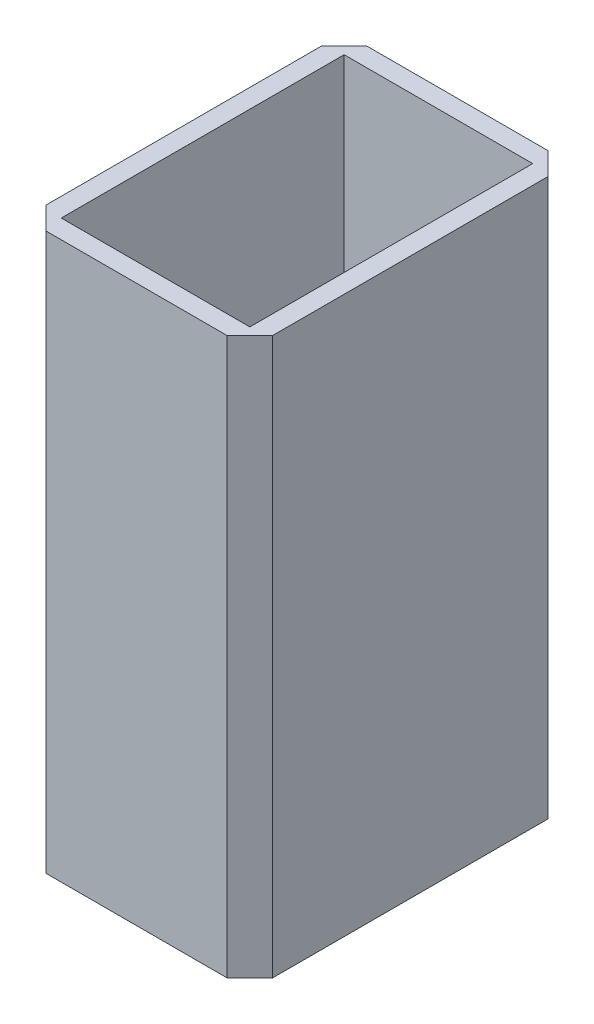
ISO-10303-21;
HEADER;
FILE_DESCRIPTION(('STEP AP214'),'2;1');
FILE_NAME('part.step','',(''),(''),'','','');
FILE_SCHEMA(('AUTOMOTIVE_DESIGN { 1 0 10303 214 1 1 1 1 }'));
ENDSEC;
DATA;
#1=APPLICATION_CONTEXT('core data for automotive mechanical design processes');
#2=APPLICATION_PROTOCOL_DEFINITION('international standard','automotive_design',2000,#1);
#3=PRODUCT_CONTEXT('',#1,'mechanical');
#4=PRODUCT('Part','Part','',(#3));
#5=PRODUCT_RELATED_PRODUCT_CATEGORY('part','',(#4));
#6=PRODUCT_DEFINITION_FORMATION('','',#4);
#7=PRODUCT_DEFINITION_CONTEXT('part definition',#1,'design');
#8=PRODUCT_DEFINITION('design','',#6,#7);
#9=PRODUCT_DEFINITION_SHAPE('','',#8);
#10=(LENGTH_UNIT() NAMED_UNIT(*) SI_UNIT(.MILLI.,.METRE.));
#11=(NAMED_UNIT(*) PLANE_ANGLE_UNIT() SI_UNIT($,.RADIAN.));
#12=(NAMED_UNIT(*) SI_UNIT($,.STERADIAN.) SOLID_ANGLE_UNIT());
#13=UNCERTAINTY_MEASURE_WITH_UNIT(LENGTH_MEASURE(1.E-05),#10,'distance_accuracy_value','');
#14=(GEOMETRIC_REPRESENTATION_CONTEXT(3) GLOBAL_UNCERTAINTY_ASSIGNED_CONTEXT((#13)) GLOBAL_UNIT_ASSIGNED_CONTEXT((#10,
#11,#12)) REPRESENTATION_CONTEXT('',''));
#15=CARTESIAN_POINT('',(0.,0.,0.));
#16=DIRECTION('',(0.,0.,1.));
#17=DIRECTION('',(1.,0.,0.));
#18=AXIS2_PLACEMENT_3D('',#15,#16,#17);
#19=CARTESIAN_POINT('',(-52.5950076131494,3.175,10.6202395854022));
#20=DIRECTION('',(1.,0.,0.));
#21=DIRECTION('',(0.,0.,-1.));
#22=AXIS2_PLACEMENT_3D('',#19,#20,#21);
#23=PLANE('',#22);
#24=DIRECTION('',(0.,0.,1.));
#25=VECTOR('',#24,1.);
#26=CARTESIAN_POINT('',(-52.5950076131494,0.,10.6202395854022));
#27=LINE('',#26,#25);
#28=CARTESIAN_POINT('',(-52.5950076131494,0.,14.4302395854022));
#29=VERTEX_POINT('',#28);
#30=CARTESIAN_POINT('',(-52.5950076131494,0.,60.7852395854022));
#31=VERTEX_POINT('',#30);
#32=EDGE_CURVE('E175',#29,#31,#27,.T.);
#33=ORIENTED_EDGE('',*,*,#32,.T.);
#34=DIRECTION('',(0.,1.,0.));
#35=VECTOR('',#34,1.);
#36=CARTESIAN_POINT('',(-52.5950076131494,3.175,60.7852395854022));
#37=LINE('',#36,#35);
#38=CARTESIAN_POINT('',(-52.5950076131494,93.6625,60.7852395854021));
#39=VERTEX_POINT('',#38);
#40=EDGE_CURVE('E11',#31,#39,#37,.T.);
#41=ORIENTED_EDGE('',*,*,#40,.T.);
#42=DIRECTION('',(0.,0.,1.));
#43=VECTOR('',#42,1.);
#44=CARTESIAN_POINT('',(-52.5950076131494,93.6625,10.6202395854022));
#45=LINE('',#44,#43);
#46=CARTESIAN_POINT('',(-52.5950076131494,93.6625,14.4302395854022));
#47=VERTEX_POINT('',#46);
#48=EDGE_CURVE('E143',#47,#39,#45,.T.);
#49=ORIENTED_EDGE('',*,*,#48,.F.);
#50=DIRECTION('',(0.,-1.,0.));
#51=VECTOR('',#50,1.);
#52=CARTESIAN_POINT('',(-52.5950076131494,3.175,14.4302395854022));
#53=LINE('',#52,#51);
#54=EDGE_CURVE('E41',#47,#29,#53,.T.);
#55=ORIENTED_EDGE('',*,*,#54,.T.);
#56=EDGE_LOOP('',(#33,#41,#49,#55));
#57=FACE_BOUND('',#56,.T.);
#58=ADVANCED_FACE('F33',(#57),#23,.F.);
#59=CARTESIAN_POINT('',(-52.5950076131494,3.175,64.5952395854022));
#60=DIRECTION('',(0.,0.,-1.));
#61=DIRECTION('',(-1.,0.,0.));
#62=AXIS2_PLACEMENT_3D('',#59,#60,#61);
#63=PLANE('',#62);
#64=DIRECTION('',(1.,0.,0.));
#65=VECTOR('',#64,1.);
#66=CARTESIAN_POINT('',(-52.5950076131494,0.,64.5952395854022));
#67=LINE('',#66,#65);
#68=CARTESIAN_POINT('',(-48.7850076131494,0.,64.5952395854022));
#69=VERTEX_POINT('',#68);
#70=CARTESIAN_POINT('',(-18.3050076131494,0.,64.5952395854022));
#71=VERTEX_POINT('',#70);
#72=EDGE_CURVE('E178',#69,#71,#67,.T.);
#73=ORIENTED_EDGE('',*,*,#72,.T.);
#74=DIRECTION('',(0.,1.,0.));
#75=VECTOR('',#74,1.);
#76=CARTESIAN_POINT('',(-18.3050076131494,3.175,64.5952395854022));
#77=LINE('',#76,#75);
#78=CARTESIAN_POINT('',(-18.3050076131494,93.6625,64.5952395854022));
#79=VERTEX_POINT('',#78);
#80=EDGE_CURVE('E202',#71,#79,#77,.T.);
#81=ORIENTED_EDGE('',*,*,#80,.T.);
#82=DIRECTION('',(1.,0.,0.));
#83=VECTOR('',#82,1.);
#84=CARTESIAN_POINT('',(-52.5950076131494,93.6625,64.5952395854022));
#85=LINE('',#84,#83);
#86=CARTESIAN_POINT('',(-48.7850076131494,93.6625,64.5952395854022));
#87=VERTEX_POINT('',#86);
#88=EDGE_CURVE('E168',#87,#79,#85,.T.);
#89=ORIENTED_EDGE('',*,*,#88,.F.);
#90=DIRECTION('',(0.,-1.,0.));
#91=VECTOR('',#90,1.);
#92=CARTESIAN_POINT('',(-48.7850076131494,3.175,64.5952395854022));
#93=LINE('',#92,#91);
#94=EDGE_CURVE('E199',#87,#69,#93,.T.);
#95=ORIENTED_EDGE('',*,*,#94,.T.);
#96=EDGE_LOOP('',(#73,#81,#89,#95));
#97=FACE_BOUND('',#96,.T.);
#98=ADVANCED_FACE('F233',(#97),#63,.F.);
#99=CARTESIAN_POINT('',(-14.4950076131494,3.175,10.6202395854022));
#100=DIRECTION('',(-1.,0.,0.));
#101=DIRECTION('',(0.,0.,1.));
#102=AXIS2_PLACEMENT_3D('',#99,#100,#101);
#103=PLANE('',#102);
#104=DIRECTION('',(0.,0.,-1.));
#105=VECTOR('',#104,1.);
#106=CARTESIAN_POINT('',(-14.4950076131494,93.6625,10.6202395854022));
#107=LINE('',#106,#105);
#108=CARTESIAN_POINT('',(-14.4950076131494,93.6625,60.7852395854022));
#109=VERTEX_POINT('',#108);
#110=CARTESIAN_POINT('',(-14.4950076131494,93.6625,14.4302395854022));
#111=VERTEX_POINT('',#110);
#112=EDGE_CURVE('E171',#109,#111,#107,.T.);
#113=ORIENTED_EDGE('',*,*,#112,.F.);
#114=DIRECTION('',(0.,-1.,0.));
#115=VECTOR('',#114,1.);
#116=CARTESIAN_POINT('',(-14.4950076131494,3.175,60.7852395854022));
#117=LINE('',#116,#115);
#118=CARTESIAN_POINT('',(-14.4950076131494,0.,60.7852395854022));
#119=VERTEX_POINT('',#118);
#120=EDGE_CURVE('E188',#109,#119,#117,.T.);
#121=ORIENTED_EDGE('',*,*,#120,.T.);
#122=DIRECTION('',(0.,0.,-1.));
#123=VECTOR('',#122,1.);
#124=CARTESIAN_POINT('',(-14.4950076131494,0.,10.6202395854022));
#125=LINE('',#124,#123);
#126=CARTESIAN_POINT('',(-14.4950076131494,0.,14.4302395854022));
#127=VERTEX_POINT('',#126);
#128=EDGE_CURVE('E181',#119,#127,#125,.T.);
#129=ORIENTED_EDGE('',*,*,#128,.T.);
#130=DIRECTION('',(0.,1.,0.));
#131=VECTOR('',#130,1.);
#132=CARTESIAN_POINT('',(-14.4950076131494,3.175,14.4302395854022));
#133=LINE('',#132,#131);
#134=EDGE_CURVE('E186',#127,#111,#133,.T.);
#135=ORIENTED_EDGE('',*,*,#134,.T.);
#136=EDGE_LOOP('',(#113,#121,#129,#135));
#137=FACE_BOUND('',#136,.T.);
#138=ADVANCED_FACE('F241',(#137),#103,.F.);
#139=CARTESIAN_POINT('',(-52.5950076131494,3.175,10.6202395854022));
#140=DIRECTION('',(0.,0.,1.));
#141=DIRECTION('',(1.,0.,0.));
#142=AXIS2_PLACEMENT_3D('',#139,#140,#141);
#143=PLANE('',#142);
#144=DIRECTION('',(-1.,0.,0.));
#145=VECTOR('',#144,1.);
#146=CARTESIAN_POINT('',(-52.5950076131494,93.6625,10.6202395854022));
#147=LINE('',#146,#145);
#148=CARTESIAN_POINT('',(-18.3050076131494,93.6625,10.6202395854022));
#149=VERTEX_POINT('',#148);
#150=CARTESIAN_POINT('',(-48.7850076131494,93.6625,10.6202395854022));
#151=VERTEX_POINT('',#150);
#152=EDGE_CURVE('E173',#149,#151,#147,.T.);
#153=ORIENTED_EDGE('',*,*,#152,.F.);
#154=DIRECTION('',(0.,-1.,0.));
#155=VECTOR('',#154,1.);
#156=CARTESIAN_POINT('',(-18.3050076131494,3.175,10.6202395854022));
#157=LINE('',#156,#155);
#158=CARTESIAN_POINT('',(-18.3050076131494,0.,10.6202395854022));
#159=VERTEX_POINT('',#158);
#160=EDGE_CURVE('E212',#149,#159,#157,.T.);
#161=ORIENTED_EDGE('',*,*,#160,.T.);
#162=DIRECTION('',(-1.,0.,0.));
#163=VECTOR('',#162,1.);
#164=CARTESIAN_POINT('',(-52.5950076131494,0.,10.6202395854022));
#165=LINE('',#164,#163);
#166=CARTESIAN_POINT('',(-48.7850076131494,0.,10.6202395854022));
#167=VERTEX_POINT('',#166);
#168=EDGE_CURVE('E184',#159,#167,#165,.T.);
#169=ORIENTED_EDGE('',*,*,#168,.T.);
#170=DIRECTION('',(0.,1.,0.));
#171=VECTOR('',#170,1.);
#172=CARTESIAN_POINT('',(-48.7850076131494,3.175,10.6202395854022));
#173=LINE('',#172,#171);
#174=EDGE_CURVE('E48',#167,#151,#173,.T.);
#175=ORIENTED_EDGE('',*,*,#174,.T.);
#176=EDGE_LOOP('',(#153,#161,#169,#175));
#177=FACE_BOUND('',#176,.T.);
#178=ADVANCED_FACE('F246',(#177),#143,.F.);
#179=CARTESIAN_POINT('',(-52.5950076131494,0.,64.5952395854022));
#180=DIRECTION('',(0.,1.,0.));
#181=DIRECTION('',(0.,0.,1.));
#182=AXIS2_PLACEMENT_3D('',#179,#180,#181);
#183=PLANE('',#182);
#184=ORIENTED_EDGE('',*,*,#128,.F.);
#185=DIRECTION('',(0.707106781186549,0.,-0.707106781186546));
#186=VECTOR('',#185,1.);
#187=CARTESIAN_POINT('',(-14.4950076131494,0.,60.7852395854022));
#188=LINE('',#187,#186);
#189=EDGE_CURVE('E197',#119,#71,#188,.F.);
#190=ORIENTED_EDGE('',*,*,#189,.T.);
#191=ORIENTED_EDGE('',*,*,#72,.F.);
#192=DIRECTION('',(0.707106781186546,0.,0.707106781186549));
#193=VECTOR('',#192,1.);
#194=CARTESIAN_POINT('',(-48.7850076131494,0.,64.5952395854022));
#195=LINE('',#194,#193);
#196=EDGE_CURVE('E193',#69,#31,#195,.F.);
#197=ORIENTED_EDGE('',*,*,#196,.T.);
#198=ORIENTED_EDGE('',*,*,#32,.F.);
#199=DIRECTION('',(-0.707106781186549,0.,0.707106781186546));
#200=VECTOR('',#199,1.);
#201=CARTESIAN_POINT('',(-52.5950076131494,0.,14.4302395854022));
#202=LINE('',#201,#200);
#203=EDGE_CURVE('E191',#29,#167,#202,.F.);
#204=ORIENTED_EDGE('',*,*,#203,.T.);
#205=ORIENTED_EDGE('',*,*,#168,.F.);
#206=DIRECTION('',(-0.707106781186546,0.,-0.707106781186549));
#207=VECTOR('',#206,1.);
#208=CARTESIAN_POINT('',(-18.3050076131494,0.,10.6202395854022));
#209=LINE('',#208,#207);
#210=EDGE_CURVE('E195',#159,#127,#209,.F.);
#211=ORIENTED_EDGE('',*,*,#210,.T.);
#212=EDGE_LOOP('',(#184,#190,#191,#197,#198,#204,#205,#211));
#213=FACE_BOUND('',#212,.T.);
#214=ADVANCED_FACE('F224',(#213),#183,.F.);
#215=CARTESIAN_POINT('',(-52.5950076131494,93.6625,64.5952395854022));
#216=DIRECTION('',(0.,1.,0.));
#217=DIRECTION('',(0.,0.,1.));
#218=AXIS2_PLACEMENT_3D('',#215,#216,#217);
#219=PLANE('',#218);
#220=ORIENTED_EDGE('',*,*,#88,.T.);
#221=DIRECTION('',(-0.707106781186549,0.,0.707106781186546));
#222=VECTOR('',#221,1.);
#223=CARTESIAN_POINT('',(-35.4500076131494,93.6625,81.7402395854022));
#224=LINE('',#223,#222);
#225=EDGE_CURVE('E209',#79,#109,#224,.F.);
#226=ORIENTED_EDGE('',*,*,#225,.T.);
#227=ORIENTED_EDGE('',*,*,#112,.T.);
#228=DIRECTION('',(0.707106781186546,0.,0.707106781186549));
#229=VECTOR('',#228,1.);
#230=CARTESIAN_POINT('',(-8.46250761314932,93.6625,20.4627395854023));
#231=LINE('',#230,#229);
#232=EDGE_CURVE('E55',#111,#149,#231,.F.);
#233=ORIENTED_EDGE('',*,*,#232,.T.);
#234=ORIENTED_EDGE('',*,*,#152,.T.);
#235=DIRECTION('',(0.707106781186549,0.,-0.707106781186546));
#236=VECTOR('',#235,1.);
#237=CARTESIAN_POINT('',(-77.6775076131494,93.6625,39.5127395854021));
#238=LINE('',#237,#236);
#239=EDGE_CURVE('E204',#151,#47,#238,.F.);
#240=ORIENTED_EDGE('',*,*,#239,.T.);
#241=ORIENTED_EDGE('',*,*,#48,.T.);
#242=DIRECTION('',(-0.707106781186546,0.,-0.707106781186549));
#243=VECTOR('',#242,1.);
#244=CARTESIAN_POINT('',(-50.6900076131494,93.6625,62.6902395854022));
#245=LINE('',#244,#243);
#246=EDGE_CURVE('E206',#39,#87,#245,.F.);
#247=ORIENTED_EDGE('',*,*,#246,.T.);
#248=EDGE_LOOP('',(#220,#226,#227,#233,#234,#240,#241,#247));
#249=FACE_BOUND('',#248,.T.);
#250=DIRECTION('',(1.,0.,0.));
#251=VECTOR('',#250,1.);
#252=CARTESIAN_POINT('',(-49.4200076131494,93.6625,61.4202395854022));
#253=LINE('',#252,#251);
#254=CARTESIAN_POINT('',(-49.4200076131494,93.6625,61.4202395854022));
#255=VERTEX_POINT('',#254);
#256=CARTESIAN_POINT('',(-17.6700076131494,93.6625,61.4202395854022));
#257=VERTEX_POINT('',#256);
#258=EDGE_CURVE('E134',#255,#257,#253,.T.);
#259=ORIENTED_EDGE('',*,*,#258,.F.);
#260=DIRECTION('',(0.,0.,1.));
#261=VECTOR('',#260,1.);
#262=CARTESIAN_POINT('',(-49.4200076131494,93.6625,13.7952395854022));
#263=LINE('',#262,#261);
#264=CARTESIAN_POINT('',(-49.4200076131494,93.6625,13.7952395854022));
#265=VERTEX_POINT('',#264);
#266=EDGE_CURVE('E124',#265,#255,#263,.T.);
#267=ORIENTED_EDGE('',*,*,#266,.F.);
#268=DIRECTION('',(-1.,0.,0.));
#269=VECTOR('',#268,1.);
#270=CARTESIAN_POINT('',(-49.4200076131494,93.6625,13.7952395854022));
#271=LINE('',#270,#269);
#272=CARTESIAN_POINT('',(-17.6700076131494,93.6625,13.7952395854022));
#273=VERTEX_POINT('',#272);
#274=EDGE_CURVE('E151',#273,#265,#271,.T.);
#275=ORIENTED_EDGE('',*,*,#274,.F.);
#276=DIRECTION('',(0.,0.,-1.));
#277=VECTOR('',#276,1.);
#278=CARTESIAN_POINT('',(-17.6700076131494,93.6625,13.7952395854022));
#279=LINE('',#278,#277);
#280=EDGE_CURVE('E149',#257,#273,#279,.T.);
#281=ORIENTED_EDGE('',*,*,#280,.F.);
#282=EDGE_LOOP('',(#259,#267,#275,#281));
#283=FACE_BOUND('',#282,.T.);
#284=ADVANCED_FACE('F147',(#249,#283),#219,.T.);
#285=CARTESIAN_POINT('',(-49.4200076131494,93.6625,13.7952395854022));
#286=DIRECTION('',(1.,0.,0.));
#287=DIRECTION('',(0.,0.,-1.));
#288=AXIS2_PLACEMENT_3D('',#285,#286,#287);
#289=PLANE('',#288);
#290=DIRECTION('',(0.,0.,1.));
#291=VECTOR('',#290,1.);
#292=CARTESIAN_POINT('',(-49.4200076131494,3.175,13.7952395854022));
#293=LINE('',#292,#291);
#294=CARTESIAN_POINT('',(-49.4200076131494,3.175,13.7952395854022));
#295=VERTEX_POINT('',#294);
#296=CARTESIAN_POINT('',(-49.4200076131494,3.175,61.4202395854022));
#297=VERTEX_POINT('',#296);
#298=EDGE_CURVE('E155',#295,#297,#293,.T.);
#299=ORIENTED_EDGE('',*,*,#298,.F.);
#300=DIRECTION('',(0.,-1.,0.));
#301=VECTOR('',#300,1.);
#302=CARTESIAN_POINT('',(-49.4200076131494,93.6625,13.7952395854022));
#303=LINE('',#302,#301);
#304=EDGE_CURVE('E130',#265,#295,#303,.T.);
#305=ORIENTED_EDGE('',*,*,#304,.F.);
#306=ORIENTED_EDGE('',*,*,#266,.T.);
#307=DIRECTION('',(0.,-1.,0.));
#308=VECTOR('',#307,1.);
#309=CARTESIAN_POINT('',(-49.4200076131494,93.6625,61.4202395854022));
#310=LINE('',#309,#308);
#311=EDGE_CURVE('E128',#255,#297,#310,.T.);
#312=ORIENTED_EDGE('',*,*,#311,.T.);
#313=EDGE_LOOP('',(#299,#305,#306,#312));
#314=FACE_BOUND('',#313,.T.);
#315=ADVANCED_FACE('F127',(#314),#289,.T.);
#316=CARTESIAN_POINT('',(-49.4200076131494,93.6625,61.4202395854022));
#317=DIRECTION('',(0.,0.,-1.));
#318=DIRECTION('',(-1.,0.,0.));
#319=AXIS2_PLACEMENT_3D('',#316,#317,#318);
#320=PLANE('',#319);
#321=DIRECTION('',(1.,0.,0.));
#322=VECTOR('',#321,1.);
#323=CARTESIAN_POINT('',(-49.4200076131494,3.175,61.4202395854022));
#324=LINE('',#323,#322);
#325=CARTESIAN_POINT('',(-17.6700076131494,3.175,61.4202395854022));
#326=VERTEX_POINT('',#325);
#327=EDGE_CURVE('E142',#297,#326,#324,.T.);
#328=ORIENTED_EDGE('',*,*,#327,.F.);
#329=ORIENTED_EDGE('',*,*,#311,.F.);
#330=ORIENTED_EDGE('',*,*,#258,.T.);
#331=DIRECTION('',(0.,-1.,0.));
#332=VECTOR('',#331,1.);
#333=CARTESIAN_POINT('',(-17.6700076131494,93.6625,61.4202395854022));
#334=LINE('',#333,#332);
#335=EDGE_CURVE('E144',#257,#326,#334,.T.);
#336=ORIENTED_EDGE('',*,*,#335,.T.);
#337=EDGE_LOOP('',(#328,#329,#330,#336));
#338=FACE_BOUND('',#337,.T.);
#339=ADVANCED_FACE('F139',(#338),#320,.T.);
#340=CARTESIAN_POINT('',(-17.6700076131494,93.6625,13.7952395854022));
#341=DIRECTION('',(-1.,0.,0.));
#342=DIRECTION('',(0.,0.,1.));
#343=AXIS2_PLACEMENT_3D('',#340,#341,#342);
#344=PLANE('',#343);
#345=DIRECTION('',(0.,0.,-1.));
#346=VECTOR('',#345,1.);
#347=CARTESIAN_POINT('',(-17.6700076131494,3.175,13.7952395854022));
#348=LINE('',#347,#346);
#349=CARTESIAN_POINT('',(-17.6700076131494,3.175,13.7952395854022));
#350=VERTEX_POINT('',#349);
#351=EDGE_CURVE('E158',#326,#350,#348,.T.);
#352=ORIENTED_EDGE('',*,*,#351,.F.);
#353=ORIENTED_EDGE('',*,*,#335,.F.);
#354=ORIENTED_EDGE('',*,*,#280,.T.);
#355=DIRECTION('',(0.,-1.,0.));
#356=VECTOR('',#355,1.);
#357=CARTESIAN_POINT('',(-17.6700076131494,93.6625,13.7952395854022));
#358=LINE('',#357,#356);
#359=EDGE_CURVE('E162',#273,#350,#358,.T.);
#360=ORIENTED_EDGE('',*,*,#359,.T.);
#361=EDGE_LOOP('',(#352,#353,#354,#360));
#362=FACE_BOUND('',#361,.T.);
#363=ADVANCED_FACE('F295',(#362),#344,.T.);
#364=CARTESIAN_POINT('',(-49.4200076131494,93.6625,13.7952395854022));
#365=DIRECTION('',(0.,0.,1.));
#366=DIRECTION('',(1.,0.,0.));
#367=AXIS2_PLACEMENT_3D('',#364,#365,#366);
#368=PLANE('',#367);
#369=DIRECTION('',(-1.,0.,0.));
#370=VECTOR('',#369,1.);
#371=CARTESIAN_POINT('',(-49.4200076131494,3.175,13.7952395854022));
#372=LINE('',#371,#370);
#373=EDGE_CURVE('E135',#350,#295,#372,.T.);
#374=ORIENTED_EDGE('',*,*,#373,.F.);
#375=ORIENTED_EDGE('',*,*,#359,.F.);
#376=ORIENTED_EDGE('',*,*,#274,.T.);
#377=ORIENTED_EDGE('',*,*,#304,.T.);
#378=EDGE_LOOP('',(#374,#375,#376,#377));
#379=FACE_BOUND('',#378,.T.);
#380=ADVANCED_FACE('F289',(#379),#368,.T.);
#381=CARTESIAN_POINT('',(-52.5950076131494,3.175,64.5952395854022));
#382=DIRECTION('',(0.,1.,0.));
#383=DIRECTION('',(0.,0.,1.));
#384=AXIS2_PLACEMENT_3D('',#381,#382,#383);
#385=PLANE('',#384);
#386=ORIENTED_EDGE('',*,*,#298,.T.);
#387=ORIENTED_EDGE('',*,*,#327,.T.);
#388=ORIENTED_EDGE('',*,*,#351,.T.);
#389=ORIENTED_EDGE('',*,*,#373,.T.);
#390=EDGE_LOOP('',(#386,#387,#388,#389));
#391=FACE_BOUND('',#390,.T.);
#392=ADVANCED_FACE('F262',(#391),#385,.T.);
#393=CARTESIAN_POINT('',(-14.4950076131494,3.175,60.7852395854022));
#394=DIRECTION('',(-0.707106781186546,0.,-0.707106781186549));
#395=DIRECTION('',(-0.707106781186549,0.,0.707106781186546));
#396=AXIS2_PLACEMENT_3D('',#393,#394,#395);
#397=PLANE('',#396);
#398=ORIENTED_EDGE('',*,*,#225,.F.);
#399=ORIENTED_EDGE('',*,*,#80,.F.);
#400=ORIENTED_EDGE('',*,*,#189,.F.);
#401=ORIENTED_EDGE('',*,*,#120,.F.);
#402=EDGE_LOOP('',(#398,#399,#400,#401));
#403=FACE_BOUND('',#402,.T.);
#404=ADVANCED_FACE('F239',(#403),#397,.F.);
#405=CARTESIAN_POINT('',(-18.3050076131494,3.175,10.6202395854022));
#406=DIRECTION('',(-0.707106781186549,0.,0.707106781186546));
#407=DIRECTION('',(0.707106781186546,0.,0.707106781186549));
#408=AXIS2_PLACEMENT_3D('',#405,#406,#407);
#409=PLANE('',#408);
#410=ORIENTED_EDGE('',*,*,#232,.F.);
#411=ORIENTED_EDGE('',*,*,#134,.F.);
#412=ORIENTED_EDGE('',*,*,#210,.F.);
#413=ORIENTED_EDGE('',*,*,#160,.F.);
#414=EDGE_LOOP('',(#410,#411,#412,#413));
#415=FACE_BOUND('',#414,.T.);
#416=ADVANCED_FACE('F245',(#415),#409,.F.);
#417=CARTESIAN_POINT('',(-48.7850076131494,3.175,64.5952395854022));
#418=DIRECTION('',(0.707106781186549,0.,-0.707106781186546));
#419=DIRECTION('',(-0.707106781186546,0.,-0.707106781186549));
#420=AXIS2_PLACEMENT_3D('',#417,#418,#419);
#421=PLANE('',#420);
#422=ORIENTED_EDGE('',*,*,#246,.F.);
#423=ORIENTED_EDGE('',*,*,#40,.F.);
#424=ORIENTED_EDGE('',*,*,#196,.F.);
#425=ORIENTED_EDGE('',*,*,#94,.F.);
#426=EDGE_LOOP('',(#422,#423,#424,#425));
#427=FACE_BOUND('',#426,.T.);
#428=ADVANCED_FACE('F230',(#427),#421,.F.);
#429=CARTESIAN_POINT('',(-52.5950076131494,3.175,14.4302395854022));
#430=DIRECTION('',(0.707106781186546,0.,0.707106781186549));
#431=DIRECTION('',(0.707106781186549,0.,-0.707106781186546));
#432=AXIS2_PLACEMENT_3D('',#429,#430,#431);
#433=PLANE('',#432);
#434=ORIENTED_EDGE('',*,*,#239,.F.);
#435=ORIENTED_EDGE('',*,*,#174,.F.);
#436=ORIENTED_EDGE('',*,*,#203,.F.);
#437=ORIENTED_EDGE('',*,*,#54,.F.);
#438=EDGE_LOOP('',(#434,#435,#436,#437));
#439=FACE_BOUND('',#438,.T.);
#440=ADVANCED_FACE('F35',(#439),#433,.F.);
#441=CLOSED_SHELL('',(#58,#98,#138,#178,#214,#284,#315,#339,#363,#380,#392,#404,#416,#428,#440));
#442=MANIFOLD_SOLID_BREP('B2',#441);
#443=ADVANCED_BREP_SHAPE_REPRESENTATION('',(#18,#442),#14);
#444=SHAPE_DEFINITION_REPRESENTATION(#9,#443);
ENDSEC;
END-ISO-10303-21;
